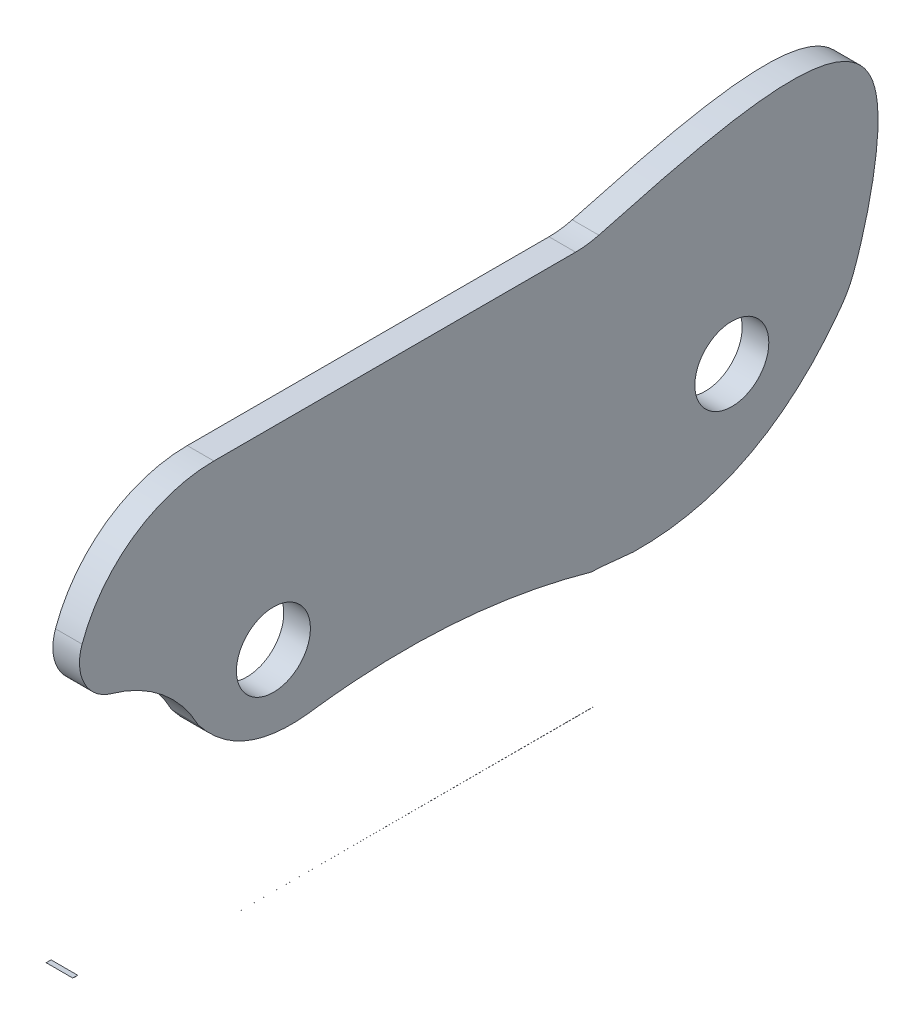
ISO-10303-21;
HEADER;
FILE_DESCRIPTION(('STEP AP214'),'2;1');
FILE_NAME('part.step','',(''),(''),'','','');
FILE_SCHEMA(('AUTOMOTIVE_DESIGN { 1 0 10303 214 1 1 1 1 }'));
ENDSEC;
DATA;
#1=APPLICATION_CONTEXT('core data for automotive mechanical design processes');
#2=APPLICATION_PROTOCOL_DEFINITION('international standard','automotive_design',2000,#1);
#3=PRODUCT_CONTEXT('',#1,'mechanical');
#4=PRODUCT('Part','Part','',(#3));
#5=PRODUCT_RELATED_PRODUCT_CATEGORY('part','',(#4));
#6=PRODUCT_DEFINITION_FORMATION('','',#4);
#7=PRODUCT_DEFINITION_CONTEXT('part definition',#1,'design');
#8=PRODUCT_DEFINITION('design','',#6,#7);
#9=PRODUCT_DEFINITION_SHAPE('','',#8);
#10=(LENGTH_UNIT() NAMED_UNIT(*) SI_UNIT(.MILLI.,.METRE.));
#11=(NAMED_UNIT(*) PLANE_ANGLE_UNIT() SI_UNIT($,.RADIAN.));
#12=(NAMED_UNIT(*) SI_UNIT($,.STERADIAN.) SOLID_ANGLE_UNIT());
#13=UNCERTAINTY_MEASURE_WITH_UNIT(LENGTH_MEASURE(1.E-05),#10,'distance_accuracy_value','');
#14=(GEOMETRIC_REPRESENTATION_CONTEXT(3) GLOBAL_UNCERTAINTY_ASSIGNED_CONTEXT((#13)) GLOBAL_UNIT_ASSIGNED_CONTEXT((#10,
#11,#12)) REPRESENTATION_CONTEXT('',''));
#15=CARTESIAN_POINT('',(0.,0.,0.));
#16=DIRECTION('',(0.,0.,1.));
#17=DIRECTION('',(1.,0.,0.));
#18=AXIS2_PLACEMENT_3D('',#15,#16,#17);
#19=CARTESIAN_POINT('',(2.40001341833316,-24.7901198806355,-19.4740823795841));
#20=DIRECTION('',(-1.,0.,0.));
#21=DIRECTION('',(0.,0.,1.));
#22=AXIS2_PLACEMENT_3D('',#19,#20,#21);
#23=CYLINDRICAL_SURFACE('',#22,9.46926716602788);
#24=CARTESIAN_POINT('',(0.60001341833316,-24.7901198806355,-19.4740823795841));
#25=DIRECTION('',(-1.,0.,0.));
#26=DIRECTION('',(0.,0.,-1.));
#27=AXIS2_PLACEMENT_3D('',#24,#25,#26);
#28=CIRCLE('',#27,9.46926716602788);
#29=CARTESIAN_POINT('',(0.60001341833316,-15.6754082380871,-22.0409973245727));
#30=VERTEX_POINT('',#29);
#31=CARTESIAN_POINT('',(0.60001341833316,-20.4302668559095,-27.8799554612099));
#32=VERTEX_POINT('',#31);
#33=EDGE_CURVE('E71',#30,#32,#28,.T.);
#34=ORIENTED_EDGE('',*,*,#33,.T.);
#35=DIRECTION('',(-1.,0.,0.));
#36=VECTOR('',#35,1.);
#37=CARTESIAN_POINT('',(2.40541363035987,-20.4302668559095,-27.8799554612099));
#38=LINE('',#37,#36);
#39=CARTESIAN_POINT('',(2.40001341833316,-20.4302668559092,-27.8799554612097));
#40=VERTEX_POINT('',#39);
#41=EDGE_CURVE('E160',#32,#40,#38,.F.);
#42=ORIENTED_EDGE('',*,*,#41,.T.);
#43=CARTESIAN_POINT('',(2.40001341833316,-24.7901198806355,-19.4740823795841));
#44=DIRECTION('',(-1.,0.,0.));
#45=DIRECTION('',(0.,0.,-1.));
#46=AXIS2_PLACEMENT_3D('',#43,#44,#45);
#47=CIRCLE('',#46,9.46926716602788);
#48=CARTESIAN_POINT('',(2.40001341833316,-15.6754082380871,-22.0409973245727));
#49=VERTEX_POINT('',#48);
#50=EDGE_CURVE('E80',#49,#40,#47,.T.);
#51=ORIENTED_EDGE('',*,*,#50,.F.);
#52=DIRECTION('',(-1.,0.,0.));
#53=VECTOR('',#52,1.);
#54=CARTESIAN_POINT('',(2.40001341833316,-15.6754082380871,-22.0409973245727));
#55=LINE('',#54,#53);
#56=EDGE_CURVE('E268',#49,#30,#55,.T.);
#57=ORIENTED_EDGE('',*,*,#56,.T.);
#58=EDGE_LOOP('',(#34,#42,#51,#57));
#59=FACE_BOUND('',#58,.T.);
#60=ADVANCED_FACE('F50',(#59),#23,.F.);
#61=CARTESIAN_POINT('',(0.60001341833316,-24.7848418515788,-54.5208886965009));
#62=CARTESIAN_POINT('',(0.60001341833316,-21.2595234428936,-42.0708640520346));
#63=CARTESIAN_POINT('',(0.60001341833316,-24.7901198806354,-28.943349545612));
#64=B_SPLINE_CURVE_WITH_KNOTS('',2,(#61,#62,#63),.UNSPECIFIED.,.F.,.F.,(3,3),(0.,1.),.UNSPECIFIED.);
#65=DIRECTION('',(1.,0.,0.));
#66=VECTOR('',#65,1.);
#67=SURFACE_OF_LINEAR_EXTRUSION('',#64,#66);
#68=CARTESIAN_POINT('',(2.40001341833316,-24.7848418515788,-54.5208886965009));
#69=CARTESIAN_POINT('',(2.40001341833316,-21.2595234428936,-42.0708640520346));
#70=CARTESIAN_POINT('',(2.40001341833316,-24.7901198806354,-28.943349545612));
#71=B_SPLINE_CURVE_WITH_KNOTS('',2,(#68,#69,#70),.UNSPECIFIED.,.F.,.F.,(3,3),(0.,1.),.UNSPECIFIED.);
#72=CARTESIAN_POINT('',(2.40001341833316,-24.7848418515788,-54.5208886965009));
#73=VERTEX_POINT('',#72);
#74=CARTESIAN_POINT('',(2.40001341833316,-23.4135283253131,-35.8601971759698));
#75=VERTEX_POINT('',#74);
#76=EDGE_CURVE('E153',#73,#75,#71,.T.);
#77=ORIENTED_EDGE('',*,*,#76,.T.);
#78=CARTESIAN_POINT('',(2.40001341833316,-23.4135283253131,-35.8601971759698));
#79=CARTESIAN_POINT('',(2.40001341833316,-23.4497514168221,-35.5774765919523));
#80=CARTESIAN_POINT('',(2.40001341833316,-23.4893386647293,-35.2944329907353));
#81=B_SPLINE_CURVE_WITH_KNOTS('',2,(#78,#79,#80),.UNSPECIFIED.,.F.,.F.,(3,3),(0.734735799910028,
0.756571213550189),.UNSPECIFIED.);
#82=CARTESIAN_POINT('',(2.40001341833316,-23.4893386647293,-35.2944329907353));
#83=VERTEX_POINT('',#82);
#84=EDGE_CURVE('E149',#75,#83,#81,.T.);
#85=ORIENTED_EDGE('',*,*,#84,.T.);
#86=DIRECTION('',(-1.,0.,0.));
#87=VECTOR('',#86,1.);
#88=CARTESIAN_POINT('',(2.40541363035987,-23.4893386647293,-35.2944329907353));
#89=LINE('',#88,#87);
#90=CARTESIAN_POINT('',(0.60001341833316,-23.4893386640537,-35.2944329955657));
#91=VERTEX_POINT('',#90);
#92=EDGE_CURVE('E159',#83,#91,#89,.T.);
#93=ORIENTED_EDGE('',*,*,#92,.T.);
#94=CARTESIAN_POINT('',(0.60001341833316,-24.7848418515788,-54.5208886965009));
#95=VERTEX_POINT('',#94);
#96=EDGE_CURVE('E251',#95,#91,#64,.T.);
#97=ORIENTED_EDGE('',*,*,#96,.F.);
#98=DIRECTION('',(1.,0.,0.));
#99=VECTOR('',#98,1.);
#100=CARTESIAN_POINT('',(0.60001341833316,-24.7848418515788,-54.5208886965009));
#101=LINE('',#100,#99);
#102=EDGE_CURVE('E165',#95,#73,#101,.T.);
#103=ORIENTED_EDGE('',*,*,#102,.T.);
#104=EDGE_LOOP('',(#77,#85,#93,#97,#103));
#105=FACE_BOUND('',#104,.T.);
#106=ADVANCED_FACE('F163',(#105),#67,.F.);
#107=CARTESIAN_POINT('',(2.40001341833316,-15.3208527146077,-54.2047711916011));
#108=DIRECTION('',(1.,0.,0.));
#109=DIRECTION('',(0.,0.,-1.));
#110=AXIS2_PLACEMENT_3D('',#107,#108,#109);
#111=PLANE('',#110);
#112=CARTESIAN_POINT('',(2.40001341833316,-18.5693317054409,-32.9699554674754));
#113=DIRECTION('',(1.,0.,0.));
#114=DIRECTION('',(0.,0.,-1.));
#115=AXIS2_PLACEMENT_3D('',#112,#113,#114);
#116=CIRCLE('',#115,2.5);
#117=CARTESIAN_POINT('',(2.40001341833316,-18.5693317054409,-35.4699554674754));
#118=VERTEX_POINT('',#117);
#119=EDGE_CURVE('E273',#118,#118,#116,.T.);
#120=ORIENTED_EDGE('',*,*,#119,.F.);
#121=EDGE_LOOP('',(#120));
#122=FACE_BOUND('',#121,.T.);
#123=CARTESIAN_POINT('',(2.40001341833316,-17.3340554454409,-63.9699554612099));
#124=DIRECTION('',(1.,0.,0.));
#125=DIRECTION('',(0.,0.,-1.));
#126=AXIS2_PLACEMENT_3D('',#123,#124,#125);
#127=CIRCLE('',#126,2.50000000000001);
#128=CARTESIAN_POINT('',(2.40001341833316,-17.3340554454409,-66.4699554612099));
#129=VERTEX_POINT('',#128);
#130=EDGE_CURVE('E257',#129,#129,#127,.T.);
#131=ORIENTED_EDGE('',*,*,#130,.F.);
#132=EDGE_LOOP('',(#131));
#133=FACE_BOUND('',#132,.T.);
#134=CARTESIAN_POINT('',(2.40001341833316,-18.8503558094443,-26.8487839627127));
#135=CARTESIAN_POINT('',(2.40001341833316,-24.3600503879187,-29.8787684044366));
#136=CARTESIAN_POINT('',(2.40001341833316,-23.4135257414344,-35.8602173434093));
#137=B_SPLINE_CURVE_WITH_KNOTS('',2,(#134,#135,#136),.UNSPECIFIED.,.F.,.F.,(3,3),(0.,1.),.UNSPECIFIED.);
#138=EDGE_CURVE('E13',#83,#40,#137,.F.);
#139=ORIENTED_EDGE('',*,*,#138,.F.);
#140=ORIENTED_EDGE('',*,*,#84,.F.);
#141=ORIENTED_EDGE('',*,*,#76,.F.);
#142=CARTESIAN_POINT('',(2.40001341833316,-30.7834209932727,-54.6514577618794));
#143=DIRECTION('',(1.,0.,0.));
#144=DIRECTION('',(0.,0.,-1.));
#145=AXIS2_PLACEMENT_3D('',#142,#143,#144);
#146=CIRCLE('',#145,6.);
#147=CARTESIAN_POINT('',(2.40001341833316,-24.8171769577666,-55.2870142965699));
#148=VERTEX_POINT('',#147);
#149=EDGE_CURVE('E167',#73,#148,#146,.F.);
#150=ORIENTED_EDGE('',*,*,#149,.T.);
#151=CARTESIAN_POINT('',(2.40001341833316,-5.50343526744832,-54.204771191601));
#152=CARTESIAN_POINT('',(2.40001341833316,-3.12439738314841,-62.9559066326995));
#153=CARTESIAN_POINT('',(2.40001341833316,0.130995677376843,-74.9306573395602));
#154=CARTESIAN_POINT('',(2.40001341833316,-15.2110230733231,-73.2906471079422));
#155=CARTESIAN_POINT('',(2.40001341833316,-26.1589313071452,-67.8079800495994));
#156=CARTESIAN_POINT('',(2.40001341833316,-25.1996643362324,-58.8556764672803));
#157=CARTESIAN_POINT('',(2.40001341833316,-24.769013648199,-54.8366538029846));
#158=B_SPLINE_CURVE_WITH_KNOTS('',3,(#151,#152,#153,#154,#155,#156,#157),.UNSPECIFIED.,.F.,.F.,
(4,1,1,1,4),(0.,0.376783583733936,0.5155776088737,0.782524737781,1.),.UNSPECIFIED.);
#159=CARTESIAN_POINT('',(2.40001341833316,-25.0205507828051,-57.3358438481414));
#160=VERTEX_POINT('',#159);
#161=EDGE_CURVE('E193',#160,#148,#158,.T.);
#162=ORIENTED_EDGE('',*,*,#161,.F.);
#163=CARTESIAN_POINT('',(2.40001341833316,-24.7848418515788,-54.5208886965009));
#164=CARTESIAN_POINT('',(2.40001341833316,-26.4123610341012,-65.5124253666385));
#165=CARTESIAN_POINT('',(2.40001341833316,-16.9140161600656,-71.8893045542904));
#166=B_SPLINE_CURVE_WITH_KNOTS('',2,(#163,#164,#165),.UNSPECIFIED.,.F.,.F.,(3,3),(0.,1.),.UNSPECIFIED.);
#167=CARTESIAN_POINT('',(2.40001341833316,-17.5759579812547,-71.4295946913671));
#168=VERTEX_POINT('',#167);
#169=EDGE_CURVE('E171',#160,#168,#166,.T.);
#170=ORIENTED_EDGE('',*,*,#169,.T.);
#171=CARTESIAN_POINT('',(2.40001341833316,-14.0745855446981,-66.5571834750881));
#172=DIRECTION('',(1.,0.,0.));
#173=DIRECTION('',(0.,0.,-1.));
#174=AXIS2_PLACEMENT_3D('',#171,#172,#173);
#175=CIRCLE('',#174,6.);
#176=CARTESIAN_POINT('',(2.40001341833316,-16.1624216085445,-72.1822115257295));
#177=VERTEX_POINT('',#176);
#178=EDGE_CURVE('E319',#168,#177,#175,.T.);
#179=ORIENTED_EDGE('',*,*,#178,.T.);
#180=CARTESIAN_POINT('',(2.40001341833316,-5.29405544544093,-54.9754492674754));
#181=VERTEX_POINT('',#180);
#182=EDGE_CURVE('E181',#181,#177,#158,.T.);
#183=ORIENTED_EDGE('',*,*,#182,.F.);
#184=CARTESIAN_POINT('',(2.40001341833316,0.496564732551688,-53.4042338289614));
#185=DIRECTION('',(1.,0.,0.));
#186=DIRECTION('',(0.,0.,-1.));
#187=AXIS2_PLACEMENT_3D('',#184,#185,#186);
#188=CIRCLE('',#187,6.);
#189=CARTESIAN_POINT('',(2.40001341833316,-5.50343526744831,-53.4042338289613));
#190=VERTEX_POINT('',#189);
#191=EDGE_CURVE('E359',#181,#190,#188,.F.);
#192=ORIENTED_EDGE('',*,*,#191,.T.);
#193=DIRECTION('',(0.,0.,1.));
#194=VECTOR('',#193,1.);
#195=CARTESIAN_POINT('',(2.40001341833316,-5.50343526744831,-28.943349545612));
#196=LINE('',#195,#194);
#197=CARTESIAN_POINT('',(2.40001341833316,-5.50343526744831,-28.943349545612));
#198=VERTEX_POINT('',#197);
#199=EDGE_CURVE('E357',#190,#198,#196,.T.);
#200=ORIENTED_EDGE('',*,*,#199,.T.);
#201=CARTESIAN_POINT('',(2.40001341833316,-14.9727024334761,-28.9433495456119));
#202=DIRECTION('',(1.,0.,0.));
#203=DIRECTION('',(0.,0.,-1.));
#204=AXIS2_PLACEMENT_3D('',#201,#202,#203);
#205=CIRCLE('',#204,9.46926716602774);
#206=CARTESIAN_POINT('',(2.40001341833316,-11.7745000105935,-20.0305204816234));
#207=VERTEX_POINT('',#206);
#208=EDGE_CURVE('E302',#198,#207,#205,.T.);
#209=ORIENTED_EDGE('',*,*,#208,.T.);
#210=CARTESIAN_POINT('',(2.40001341833316,-12.7877365261994,-22.8542328896853));
#211=DIRECTION('',(1.,0.,0.));
#212=DIRECTION('',(0.,0.,-1.));
#213=AXIS2_PLACEMENT_3D('',#210,#211,#212);
#214=CIRCLE('',#213,3.);
#215=EDGE_CURVE('E299',#207,#49,#214,.T.);
#216=ORIENTED_EDGE('',*,*,#215,.T.);
#217=ORIENTED_EDGE('',*,*,#50,.T.);
#218=EDGE_LOOP('',(#139,#140,#141,#150,#162,#170,#179,#183,#192,#200,#209,#216,#217));
#219=FACE_BOUND('',#218,.T.);
#220=ADVANCED_FACE('F52',(#122,#133,#219),#111,.T.);
#221=CARTESIAN_POINT('',(0.60001341833316,-15.3208527146077,-54.2047711916011));
#222=DIRECTION('',(1.,0.,0.));
#223=DIRECTION('',(0.,0.,-1.));
#224=AXIS2_PLACEMENT_3D('',#221,#222,#223);
#225=PLANE('',#224);
#226=CARTESIAN_POINT('',(0.60001341833316,-18.5693317054409,-32.9699554674754));
#227=DIRECTION('',(-1.,0.,0.));
#228=DIRECTION('',(0.,0.,1.));
#229=AXIS2_PLACEMENT_3D('',#226,#227,#228);
#230=CIRCLE('',#229,2.5);
#231=CARTESIAN_POINT('',(0.60001341833316,-18.5693317054409,-30.4699554674754));
#232=VERTEX_POINT('',#231);
#233=EDGE_CURVE('E277',#232,#232,#230,.T.);
#234=ORIENTED_EDGE('',*,*,#233,.F.);
#235=EDGE_LOOP('',(#234));
#236=FACE_BOUND('',#235,.T.);
#237=CARTESIAN_POINT('',(0.60001341833316,-17.3340554454409,-63.9699554612099));
#238=DIRECTION('',(-1.,0.,0.));
#239=DIRECTION('',(0.,0.,1.));
#240=AXIS2_PLACEMENT_3D('',#237,#238,#239);
#241=CIRCLE('',#240,2.50000000000001);
#242=CARTESIAN_POINT('',(0.60001341833316,-17.3340554454409,-61.4699554612099));
#243=VERTEX_POINT('',#242);
#244=EDGE_CURVE('E269',#243,#243,#241,.T.);
#245=ORIENTED_EDGE('',*,*,#244,.F.);
#246=EDGE_LOOP('',(#245));
#247=FACE_BOUND('',#246,.T.);
#248=ORIENTED_EDGE('',*,*,#96,.T.);
#249=CARTESIAN_POINT('',(0.60001341833316,-18.8503558094443,-26.8487839627127));
#250=CARTESIAN_POINT('',(0.60001341833316,-24.3600503879187,-29.8787684044366));
#251=CARTESIAN_POINT('',(0.60001341833316,-23.4135257414344,-35.8602173434093));
#252=B_SPLINE_CURVE_WITH_KNOTS('',2,(#249,#250,#251),.UNSPECIFIED.,.F.,.F.,(3,3),(0.,1.),.UNSPECIFIED.);
#253=EDGE_CURVE('E63',#32,#91,#252,.T.);
#254=ORIENTED_EDGE('',*,*,#253,.F.);
#255=ORIENTED_EDGE('',*,*,#33,.F.);
#256=CARTESIAN_POINT('',(0.60001341833316,-12.7877365261994,-22.8542328896853));
#257=DIRECTION('',(1.,0.,0.));
#258=DIRECTION('',(0.,0.,-1.));
#259=AXIS2_PLACEMENT_3D('',#256,#257,#258);
#260=CIRCLE('',#259,3.);
#261=CARTESIAN_POINT('',(0.60001341833316,-11.7745000105935,-20.0305204816234));
#262=VERTEX_POINT('',#261);
#263=EDGE_CURVE('E294',#30,#262,#260,.F.);
#264=ORIENTED_EDGE('',*,*,#263,.T.);
#265=CARTESIAN_POINT('',(0.60001341833316,-14.9727024334761,-28.9433495456119));
#266=DIRECTION('',(1.,0.,0.));
#267=DIRECTION('',(0.,0.,-1.));
#268=AXIS2_PLACEMENT_3D('',#265,#266,#267);
#269=CIRCLE('',#268,9.46926716602774);
#270=CARTESIAN_POINT('',(0.60001341833316,-5.50343526744831,-28.943349545612));
#271=VERTEX_POINT('',#270);
#272=EDGE_CURVE('E342',#271,#262,#269,.T.);
#273=ORIENTED_EDGE('',*,*,#272,.F.);
#274=DIRECTION('',(0.,0.,1.));
#275=VECTOR('',#274,1.);
#276=CARTESIAN_POINT('',(0.60001341833316,-5.50343526744831,-28.943349545612));
#277=LINE('',#276,#275);
#278=CARTESIAN_POINT('',(0.60001341833316,-5.50343526744831,-53.4042338289613));
#279=VERTEX_POINT('',#278);
#280=EDGE_CURVE('E350',#279,#271,#277,.T.);
#281=ORIENTED_EDGE('',*,*,#280,.F.);
#282=CARTESIAN_POINT('',(0.60001341833316,0.496564732551688,-53.4042338289614));
#283=DIRECTION('',(1.,0.,0.));
#284=DIRECTION('',(0.,0.,-1.));
#285=AXIS2_PLACEMENT_3D('',#282,#283,#284);
#286=CIRCLE('',#285,6.);
#287=CARTESIAN_POINT('',(0.60001341833316,-5.29405544544093,-54.9754492674754));
#288=VERTEX_POINT('',#287);
#289=EDGE_CURVE('E297',#279,#288,#286,.T.);
#290=ORIENTED_EDGE('',*,*,#289,.T.);
#291=CARTESIAN_POINT('',(0.60001341833316,-5.50343526744832,-54.204771191601));
#292=CARTESIAN_POINT('',(0.60001341833316,-3.12439738314841,-62.9559066326995));
#293=CARTESIAN_POINT('',(0.60001341833316,0.130995677376843,-74.9306573395602));
#294=CARTESIAN_POINT('',(0.60001341833316,-15.2110230733231,-73.2906471079422));
#295=CARTESIAN_POINT('',(0.60001341833316,-26.1589313071452,-67.8079800495994));
#296=CARTESIAN_POINT('',(0.60001341833316,-25.1996643362324,-58.8556764672803));
#297=CARTESIAN_POINT('',(0.60001341833316,-24.769013648199,-54.8366538029846));
#298=B_SPLINE_CURVE_WITH_KNOTS('',3,(#291,#292,#293,#294,#295,#296,#297),.UNSPECIFIED.,.F.,.F.,
(4,1,1,1,4),(0.,0.376783583733936,0.5155776088737,0.782524737781,1.),.UNSPECIFIED.);
#299=CARTESIAN_POINT('',(0.60001341833316,-16.1624216085445,-72.1822115257295));
#300=VERTEX_POINT('',#299);
#301=EDGE_CURVE('E194',#288,#300,#298,.T.);
#302=ORIENTED_EDGE('',*,*,#301,.T.);
#303=CARTESIAN_POINT('',(0.60001341833316,-14.0745855446981,-66.5571834750881));
#304=DIRECTION('',(1.,0.,0.));
#305=DIRECTION('',(0.,0.,-1.));
#306=AXIS2_PLACEMENT_3D('',#303,#304,#305);
#307=CIRCLE('',#306,6.);
#308=CARTESIAN_POINT('',(0.60001341833316,-17.5759579812547,-71.4295946913671));
#309=VERTEX_POINT('',#308);
#310=EDGE_CURVE('E423',#300,#309,#307,.F.);
#311=ORIENTED_EDGE('',*,*,#310,.T.);
#312=CARTESIAN_POINT('',(0.60001341833316,-24.7848418515788,-54.5208886965009));
#313=CARTESIAN_POINT('',(0.60001341833316,-26.4123610341012,-65.5124253666385));
#314=CARTESIAN_POINT('',(0.60001341833316,-16.9140161600656,-71.8893045542904));
#315=B_SPLINE_CURVE_WITH_KNOTS('',2,(#312,#313,#314),.UNSPECIFIED.,.F.,.F.,(3,3),(0.,1.),.UNSPECIFIED.);
#316=CARTESIAN_POINT('',(0.60001341833316,-25.0205507828051,-57.3358438481414));
#317=VERTEX_POINT('',#316);
#318=EDGE_CURVE('E256',#317,#309,#315,.T.);
#319=ORIENTED_EDGE('',*,*,#318,.F.);
#320=CARTESIAN_POINT('',(0.60001341833316,-24.8171769577657,-55.2870142965607));
#321=VERTEX_POINT('',#320);
#322=EDGE_CURVE('E426',#317,#321,#298,.T.);
#323=ORIENTED_EDGE('',*,*,#322,.T.);
#324=CARTESIAN_POINT('',(0.60001341833316,-30.7834209932727,-54.6514577618794));
#325=DIRECTION('',(1.,0.,0.));
#326=DIRECTION('',(0.,0.,-1.));
#327=AXIS2_PLACEMENT_3D('',#324,#325,#326);
#328=CIRCLE('',#327,6.);
#329=EDGE_CURVE('E292',#321,#95,#328,.T.);
#330=ORIENTED_EDGE('',*,*,#329,.T.);
#331=EDGE_LOOP('',(#248,#254,#255,#264,#273,#281,#290,#302,#311,#319,#323,#330));
#332=FACE_BOUND('',#331,.T.);
#333=ADVANCED_FACE('F207',(#236,#247,#332),#225,.F.);
#334=DIRECTION('',(-1.,0.,0.));
#335=VECTOR('',#334,1.);
#336=SURFACE_OF_LINEAR_EXTRUSION('',#158,#335);
#337=ORIENTED_EDGE('',*,*,#322,.F.);
#338=DIRECTION('',(1.,0.,0.));
#339=VECTOR('',#338,1.);
#340=CARTESIAN_POINT('',(-74.9383125257199,-25.0205507828056,-57.3358438481414));
#341=LINE('',#340,#339);
#342=EDGE_CURVE('E235',#317,#160,#341,.T.);
#343=ORIENTED_EDGE('',*,*,#342,.T.);
#344=ORIENTED_EDGE('',*,*,#161,.T.);
#345=DIRECTION('',(-1.,0.,0.));
#346=VECTOR('',#345,1.);
#347=CARTESIAN_POINT('',(2.40001341833316,-24.8171769577666,-55.2870142965699));
#348=LINE('',#347,#346);
#349=EDGE_CURVE('E192',#148,#321,#348,.T.);
#350=ORIENTED_EDGE('',*,*,#349,.T.);
#351=EDGE_LOOP('',(#337,#343,#344,#350));
#352=FACE_BOUND('',#351,.T.);
#353=ADVANCED_FACE('F202',(#352),#336,.T.);
#354=ORIENTED_EDGE('',*,*,#182,.T.);
#355=DIRECTION('',(-1.,0.,0.));
#356=VECTOR('',#355,1.);
#357=CARTESIAN_POINT('',(2.40001341833316,-16.1624216085445,-72.1822115257295));
#358=LINE('',#357,#356);
#359=EDGE_CURVE('E191',#177,#300,#358,.T.);
#360=ORIENTED_EDGE('',*,*,#359,.T.);
#361=ORIENTED_EDGE('',*,*,#301,.F.);
#362=DIRECTION('',(-1.,0.,0.));
#363=VECTOR('',#362,1.);
#364=CARTESIAN_POINT('',(0.60001341833316,-5.29405544544093,-54.9754492674754));
#365=LINE('',#364,#363);
#366=EDGE_CURVE('E372',#288,#181,#365,.F.);
#367=ORIENTED_EDGE('',*,*,#366,.T.);
#368=EDGE_LOOP('',(#354,#360,#361,#367));
#369=FACE_BOUND('',#368,.T.);
#370=ADVANCED_FACE('F206',(#369),#336,.T.);
#371=CARTESIAN_POINT('',(2.40001341833316,-5.50343526744831,-28.943349545612));
#372=DIRECTION('',(0.,-1.,0.));
#373=DIRECTION('',(0.,0.,-1.));
#374=AXIS2_PLACEMENT_3D('',#371,#372,#373);
#375=PLANE('',#374);
#376=ORIENTED_EDGE('',*,*,#199,.F.);
#377=DIRECTION('',(-1.,0.,0.));
#378=VECTOR('',#377,1.);
#379=CARTESIAN_POINT('',(2.40001341833316,-5.50343526744831,-53.4042338289614));
#380=LINE('',#379,#378);
#381=EDGE_CURVE('E353',#190,#279,#380,.T.);
#382=ORIENTED_EDGE('',*,*,#381,.T.);
#383=ORIENTED_EDGE('',*,*,#280,.T.);
#384=DIRECTION('',(-1.,0.,0.));
#385=VECTOR('',#384,1.);
#386=CARTESIAN_POINT('',(2.40001341833316,-5.50343526744831,-28.943349545612));
#387=LINE('',#386,#385);
#388=EDGE_CURVE('E311',#198,#271,#387,.T.);
#389=ORIENTED_EDGE('',*,*,#388,.F.);
#390=EDGE_LOOP('',(#376,#382,#383,#389));
#391=FACE_BOUND('',#390,.T.);
#392=ADVANCED_FACE('F218',(#391),#375,.F.);
#393=CARTESIAN_POINT('',(2.40001341833316,-14.9727024334761,-28.9433495456119));
#394=DIRECTION('',(-1.,0.,0.));
#395=DIRECTION('',(0.,0.,1.));
#396=AXIS2_PLACEMENT_3D('',#393,#394,#395);
#397=CYLINDRICAL_SURFACE('',#396,9.46926716602774);
#398=ORIENTED_EDGE('',*,*,#272,.T.);
#399=DIRECTION('',(-1.,0.,0.));
#400=VECTOR('',#399,1.);
#401=CARTESIAN_POINT('',(2.40001341833316,-11.7745000105935,-20.0305204816234));
#402=LINE('',#401,#400);
#403=EDGE_CURVE('E340',#262,#207,#402,.F.);
#404=ORIENTED_EDGE('',*,*,#403,.T.);
#405=ORIENTED_EDGE('',*,*,#208,.F.);
#406=ORIENTED_EDGE('',*,*,#388,.T.);
#407=EDGE_LOOP('',(#398,#404,#405,#406));
#408=FACE_BOUND('',#407,.T.);
#409=ADVANCED_FACE('F214',(#408),#397,.T.);
#410=CARTESIAN_POINT('',(1.50001341833316,0.496564732551688,-53.4042338289614));
#411=DIRECTION('',(-1.,0.,0.));
#412=DIRECTION('',(0.,0.,1.));
#413=AXIS2_PLACEMENT_3D('',#410,#411,#412);
#414=CYLINDRICAL_SURFACE('',#413,6.);
#415=ORIENTED_EDGE('',*,*,#191,.F.);
#416=ORIENTED_EDGE('',*,*,#366,.F.);
#417=ORIENTED_EDGE('',*,*,#289,.F.);
#418=ORIENTED_EDGE('',*,*,#381,.F.);
#419=EDGE_LOOP('',(#415,#416,#417,#418));
#420=FACE_BOUND('',#419,.T.);
#421=ADVANCED_FACE('F217',(#420),#414,.F.);
#422=CARTESIAN_POINT('',(1.50001341833316,-30.7834209932727,-54.6514577618794));
#423=DIRECTION('',(-1.,0.,0.));
#424=DIRECTION('',(0.,0.,1.));
#425=AXIS2_PLACEMENT_3D('',#422,#423,#424);
#426=CYLINDRICAL_SURFACE('',#425,6.);
#427=ORIENTED_EDGE('',*,*,#149,.F.);
#428=ORIENTED_EDGE('',*,*,#102,.F.);
#429=ORIENTED_EDGE('',*,*,#329,.F.);
#430=ORIENTED_EDGE('',*,*,#349,.F.);
#431=EDGE_LOOP('',(#427,#428,#429,#430));
#432=FACE_BOUND('',#431,.T.);
#433=ADVANCED_FACE('F413',(#432),#426,.F.);
#434=CARTESIAN_POINT('',(2.40001341833316,-12.7877365261994,-22.8542328896853));
#435=DIRECTION('',(1.,0.,0.));
#436=DIRECTION('',(0.,0.,-1.));
#437=AXIS2_PLACEMENT_3D('',#434,#435,#436);
#438=CYLINDRICAL_SURFACE('',#437,3.);
#439=ORIENTED_EDGE('',*,*,#215,.F.);
#440=ORIENTED_EDGE('',*,*,#403,.F.);
#441=ORIENTED_EDGE('',*,*,#263,.F.);
#442=ORIENTED_EDGE('',*,*,#56,.F.);
#443=EDGE_LOOP('',(#439,#440,#441,#442));
#444=FACE_BOUND('',#443,.T.);
#445=ADVANCED_FACE('F228',(#444),#438,.T.);
#446=CARTESIAN_POINT('',(-74.9383125257199,-24.7848418515788,-54.5208886965009));
#447=CARTESIAN_POINT('',(-74.9383125257199,-26.4123610341012,-65.5124253666385));
#448=CARTESIAN_POINT('',(-74.9383125257199,-16.9140161600656,-71.8893045542904));
#449=B_SPLINE_CURVE_WITH_KNOTS('',2,(#446,#447,#448),.UNSPECIFIED.,.F.,.F.,(3,3),(0.,1.),.UNSPECIFIED.);
#450=DIRECTION('',(1.,0.,0.));
#451=VECTOR('',#450,1.);
#452=SURFACE_OF_LINEAR_EXTRUSION('',#449,#451);
#453=ORIENTED_EDGE('',*,*,#318,.T.);
#454=DIRECTION('',(1.,0.,0.));
#455=VECTOR('',#454,1.);
#456=CARTESIAN_POINT('',(0.60001341833316,-17.5759579812547,-71.4295946913671));
#457=LINE('',#456,#455);
#458=EDGE_CURVE('E327',#309,#168,#457,.T.);
#459=ORIENTED_EDGE('',*,*,#458,.T.);
#460=ORIENTED_EDGE('',*,*,#169,.F.);
#461=ORIENTED_EDGE('',*,*,#342,.F.);
#462=EDGE_LOOP('',(#453,#459,#460,#461));
#463=FACE_BOUND('',#462,.T.);
#464=ADVANCED_FACE('F223',(#463),#452,.T.);
#465=CARTESIAN_POINT('',(1.50001341833316,-14.0745855446981,-66.5571834750881));
#466=DIRECTION('',(-1.,0.,0.));
#467=DIRECTION('',(0.,0.,1.));
#468=AXIS2_PLACEMENT_3D('',#465,#466,#467);
#469=CYLINDRICAL_SURFACE('',#468,6.);
#470=ORIENTED_EDGE('',*,*,#310,.F.);
#471=ORIENTED_EDGE('',*,*,#359,.F.);
#472=ORIENTED_EDGE('',*,*,#178,.F.);
#473=ORIENTED_EDGE('',*,*,#458,.F.);
#474=EDGE_LOOP('',(#470,#471,#472,#473));
#475=FACE_BOUND('',#474,.T.);
#476=ADVANCED_FACE('F227',(#475),#469,.T.);
#477=CARTESIAN_POINT('',(2.40541363035987,-18.8503558094443,-26.8487839627127));
#478=CARTESIAN_POINT('',(2.40541363035987,-24.3600503879187,-29.8787684044366));
#479=CARTESIAN_POINT('',(2.40541363035987,-23.4135257414344,-35.8602173434093));
#480=B_SPLINE_CURVE_WITH_KNOTS('',2,(#477,#478,#479),.UNSPECIFIED.,.F.,.F.,(3,3),(0.,1.),.UNSPECIFIED.);
#481=DIRECTION('',(-1.,0.,0.));
#482=VECTOR('',#481,1.);
#483=SURFACE_OF_LINEAR_EXTRUSION('',#480,#482);
#484=ORIENTED_EDGE('',*,*,#253,.T.);
#485=ORIENTED_EDGE('',*,*,#92,.F.);
#486=ORIENTED_EDGE('',*,*,#138,.T.);
#487=ORIENTED_EDGE('',*,*,#41,.F.);
#488=EDGE_LOOP('',(#484,#485,#486,#487));
#489=FACE_BOUND('',#488,.T.);
#490=ADVANCED_FACE('F230',(#489),#483,.F.);
#491=CARTESIAN_POINT('',(3.00452228510576,-17.3340554454409,-63.9699554612099));
#492=DIRECTION('',(-1.,0.,0.));
#493=DIRECTION('',(0.,0.,1.));
#494=AXIS2_PLACEMENT_3D('',#491,#492,#493);
#495=CYLINDRICAL_SURFACE('',#494,2.50000000000001);
#496=ORIENTED_EDGE('',*,*,#130,.T.);
#497=EDGE_LOOP('',(#496));
#498=FACE_BOUND('',#497,.T.);
#499=ORIENTED_EDGE('',*,*,#244,.T.);
#500=EDGE_LOOP('',(#499));
#501=FACE_BOUND('',#500,.T.);
#502=ADVANCED_FACE('F397',(#498,#501),#495,.F.);
#503=CARTESIAN_POINT('',(10.6000134183332,-18.5693317054409,-32.9699554674754));
#504=DIRECTION('',(-1.,0.,0.));
#505=DIRECTION('',(0.,0.,1.));
#506=AXIS2_PLACEMENT_3D('',#503,#504,#505);
#507=CYLINDRICAL_SURFACE('',#506,2.5);
#508=ORIENTED_EDGE('',*,*,#119,.T.);
#509=EDGE_LOOP('',(#508));
#510=FACE_BOUND('',#509,.T.);
#511=ORIENTED_EDGE('',*,*,#233,.T.);
#512=EDGE_LOOP('',(#511));
#513=FACE_BOUND('',#512,.T.);
#514=ADVANCED_FACE('F282',(#510,#513),#507,.F.);
#515=CLOSED_SHELL('',(#60,#106,#220,#333,#353,#370,#392,#409,#421,#433,#445,#464,#476,#490,#502,#514));
#516=MANIFOLD_SOLID_BREP('B2',#515);
#517=CARTESIAN_POINT('',(1.49999999999996,-28.0290522439949,-19.7454724182239));
#518=DIRECTION('',(1.,0.,0.));
#519=DIRECTION('',(0.,0.,-1.));
#520=AXIS2_PLACEMENT_3D('',#517,#518,#519);
#521=CYLINDRICAL_SURFACE('',#520,3.);
#522=DIRECTION('',(-1.,0.,0.));
#523=VECTOR('',#522,1.);
#524=CARTESIAN_POINT('',(2.40540021202667,-31.0290522439949,-19.7454724182238));
#525=LINE('',#524,#523);
#526=CARTESIAN_POINT('',(2.39999999999996,-31.0290522439949,-19.7454724182238));
#527=VERTEX_POINT('',#526);
#528=CARTESIAN_POINT('',(0.599999999999959,-31.0290522439949,-19.7454724182238));
#529=VERTEX_POINT('',#528);
#530=EDGE_CURVE('E48',#527,#529,#525,.T.);
#531=ORIENTED_EDGE('',*,*,#530,.F.);
#532=CARTESIAN_POINT('',(2.39999999999996,-28.0290522439949,-19.7454724182239));
#533=DIRECTION('',(1.,0.,0.));
#534=DIRECTION('',(0.,0.,-1.));
#535=AXIS2_PLACEMENT_3D('',#532,#533,#534);
#536=CIRCLE('',#535,3.);
#537=CARTESIAN_POINT('',(2.39999999999996,-31.0080639332115,-19.3912276504279));
#538=VERTEX_POINT('',#537);
#539=EDGE_CURVE('E608',#538,#527,#536,.T.);
#540=ORIENTED_EDGE('',*,*,#539,.F.);
#541=DIRECTION('',(-1.,0.,0.));
#542=VECTOR('',#541,1.);
#543=CARTESIAN_POINT('',(2.40540021202667,-31.0080639332114,-19.3912276504279));
#544=LINE('',#543,#542);
#545=CARTESIAN_POINT('',(0.599999999999959,-31.0080639332115,-19.3912276504279));
#546=VERTEX_POINT('',#545);
#547=EDGE_CURVE('E582',#546,#538,#544,.F.);
#548=ORIENTED_EDGE('',*,*,#547,.F.);
#549=CARTESIAN_POINT('',(0.599999999999959,-28.0290522439949,-19.7454724182239));
#550=DIRECTION('',(1.,0.,0.));
#551=DIRECTION('',(0.,0.,-1.));
#552=AXIS2_PLACEMENT_3D('',#549,#550,#551);
#553=CIRCLE('',#552,3.);
#554=EDGE_CURVE('E606',#529,#546,#553,.F.);
#555=ORIENTED_EDGE('',*,*,#554,.F.);
#556=EDGE_LOOP('',(#531,#540,#548,#555));
#557=FACE_BOUND('',#556,.T.);
#558=ADVANCED_FACE('F575',(#557),#521,.T.);
#559=CARTESIAN_POINT('',(0.599999999999959,-22.2259198066916,-42.5580204436659));
#560=DIRECTION('',(1.,0.,0.));
#561=DIRECTION('',(0.,0.,-1.));
#562=AXIS2_PLACEMENT_3D('',#559,#560,#561);
#563=PLANE('',#562);
#564=ORIENTED_EDGE('',*,*,#554,.T.);
#565=CARTESIAN_POINT('',(0.599999999999959,-30.3185928335183,-24.2134665954742));
#566=CARTESIAN_POINT('',(0.599999999999959,-31.6450865607112,-21.1549574423872));
#567=CARTESIAN_POINT('',(0.599999999999959,-31.6647593296661,-13.2402333763387));
#568=CARTESIAN_POINT('',(0.599999999999959,-25.7554229015282,-15.2020332147776));
#569=B_SPLINE_CURVE_WITH_KNOTS('',3,(#565,#566,#567,#568),.UNSPECIFIED.,.F.,.F.,(4,4),(0.,1.),.UNSPECIFIED.);
#570=EDGE_CURVE('E588',#529,#546,#569,.T.);
#571=ORIENTED_EDGE('',*,*,#570,.F.);
#572=EDGE_LOOP('',(#564,#571));
#573=FACE_BOUND('',#572,.T.);
#574=ADVANCED_FACE('F605',(#573),#563,.F.);
#575=CARTESIAN_POINT('',(2.39999999999996,-22.2259198066916,-42.5580204436659));
#576=DIRECTION('',(1.,0.,0.));
#577=DIRECTION('',(0.,0.,-1.));
#578=AXIS2_PLACEMENT_3D('',#575,#576,#577);
#579=PLANE('',#578);
#580=CARTESIAN_POINT('',(2.39999999999996,-30.3185928335183,-24.2134665954742));
#581=CARTESIAN_POINT('',(2.39999999999996,-31.6450865607112,-21.1549574423872));
#582=CARTESIAN_POINT('',(2.39999999999996,-31.6647593296661,-13.2402333763387));
#583=CARTESIAN_POINT('',(2.39999999999996,-25.7554229015282,-15.2020332147776));
#584=B_SPLINE_CURVE_WITH_KNOTS('',3,(#580,#581,#582,#583),.UNSPECIFIED.,.F.,.F.,(4,4),(0.,1.),.UNSPECIFIED.);
#585=EDGE_CURVE('E593',#538,#527,#584,.F.);
#586=ORIENTED_EDGE('',*,*,#585,.F.);
#587=ORIENTED_EDGE('',*,*,#539,.T.);
#588=EDGE_LOOP('',(#586,#587));
#589=FACE_BOUND('',#588,.T.);
#590=ADVANCED_FACE('F615',(#589),#579,.T.);
#591=CARTESIAN_POINT('',(2.40540021202667,-30.3185928335183,-24.2134665954742));
#592=CARTESIAN_POINT('',(2.40540021202667,-31.6450865607112,-21.1549574423872));
#593=CARTESIAN_POINT('',(2.40540021202667,-31.6647593296661,-13.2402333763387));
#594=CARTESIAN_POINT('',(2.40540021202667,-25.7554229015282,-15.2020332147776));
#595=B_SPLINE_CURVE_WITH_KNOTS('',3,(#591,#592,#593,#594),.UNSPECIFIED.,.F.,.F.,(4,4),(0.,1.),.UNSPECIFIED.);
#596=DIRECTION('',(-1.,0.,0.));
#597=VECTOR('',#596,1.);
#598=SURFACE_OF_LINEAR_EXTRUSION('',#595,#597);
#599=ORIENTED_EDGE('',*,*,#530,.T.);
#600=ORIENTED_EDGE('',*,*,#570,.T.);
#601=ORIENTED_EDGE('',*,*,#547,.T.);
#602=ORIENTED_EDGE('',*,*,#585,.T.);
#603=EDGE_LOOP('',(#599,#600,#601,#602));
#604=FACE_BOUND('',#603,.T.);
#605=ADVANCED_FACE('F598',(#604),#598,.F.);
#606=CLOSED_SHELL('',(#558,#574,#590,#605));
#607=MANIFOLD_SOLID_BREP('B7',#606);
#608=CARTESIAN_POINT('',(2.99911207307905,-22.6734546904674,-53.7581258604057));
#609=DIRECTION('',(1.,0.,0.));
#610=DIRECTION('',(0.,0.,-1.));
#611=AXIS2_PLACEMENT_3D('',#608,#609,#610);
#612=PLANE('',#611);
#613=DIRECTION('',(0.,0.000206354055921188,-0.999999978709002));
#614=VECTOR('',#613,1.);
#615=CARTESIAN_POINT('',(2.99911207307905,-32.1374438274385,-54.0742433653056));
#616=LINE('',#615,#614);
#617=CARTESIAN_POINT('',(2.99911207307905,-32.1427218564952,-28.4967042144166));
#618=VERTEX_POINT('',#617);
#619=CARTESIAN_POINT('',(2.99911207307905,-32.1374438274385,-54.0742433653056));
#620=VERTEX_POINT('',#619);
#621=EDGE_CURVE('E699',#618,#620,#616,.T.);
#622=ORIENTED_EDGE('',*,*,#621,.F.);
#623=DIRECTION('',(0.,0.,-1.));
#624=VECTOR('',#623,1.);
#625=CARTESIAN_POINT('',(2.99911207307905,-32.1427218564952,-28.4967042144166));
#626=LINE('',#625,#624);
#627=CARTESIAN_POINT('',(2.99911207307905,-32.1427218564952,-53.7581258604057));
#628=VERTEX_POINT('',#627);
#629=EDGE_CURVE('E704',#618,#628,#626,.T.);
#630=ORIENTED_EDGE('',*,*,#629,.T.);
#631=CARTESIAN_POINT('',(2.99911207307905,-22.6734546904674,-53.7581258604057));
#632=DIRECTION('',(1.,0.,0.));
#633=DIRECTION('',(0.,0.,-1.));
#634=AXIS2_PLACEMENT_3D('',#631,#632,#633);
#635=CIRCLE('',#634,9.46926716602774);
#636=EDGE_CURVE('E697',#628,#620,#635,.T.);
#637=ORIENTED_EDGE('',*,*,#636,.T.);
#638=EDGE_LOOP('',(#622,#630,#637));
#639=FACE_BOUND('',#638,.T.);
#640=ADVANCED_FACE('F669',(#639),#612,.T.);
#641=CARTESIAN_POINT('',(1.19911207307905,-32.1374438274385,-54.0742433653056));
#642=DIRECTION('',(0.,-0.999999978709001,-0.000206354055921188));
#643=DIRECTION('',(0.,0.000206354055921188,-0.999999978709002));
#644=AXIS2_PLACEMENT_3D('',#641,#642,#643);
#645=PLANE('',#644);
#646=ORIENTED_EDGE('',*,*,#621,.T.);
#647=CARTESIAN_POINT('',(2.99911207307905,-32.1374438274385,-54.0742433653056));
#648=CARTESIAN_POINT('',(2.99733010819912,-32.1374546963515,-54.0215721800871));
#649=CARTESIAN_POINT('',(2.99599649883604,-32.137465566819,-53.9688934614341));
#650=CARTESIAN_POINT('',(2.99422599118629,-32.1374873108625,-53.8635209598));
#651=CARTESIAN_POINT('',(2.99378909285637,-32.1374981844386,-53.8108271768198));
#652=CARTESIAN_POINT('',(2.99380055000006,-32.1375090595692,-53.7581258604057));
#653=B_SPLINE_CURVE_WITH_KNOTS('',3,(#647,#648,#649,#650,#651,#652),.UNSPECIFIED.,.F.,.F.,(4,2,
4),(0.,0.158086793500437,0.316173579375802),.UNSPECIFIED.);
#654=CARTESIAN_POINT('',(2.99380055000006,-32.1375090595692,-53.7581258604057));
#655=VERTEX_POINT('',#654);
#656=EDGE_CURVE('E573',#620,#655,#653,.T.);
#657=ORIENTED_EDGE('',*,*,#656,.T.);
#658=CARTESIAN_POINT('',(7.19911207307905,-27.8578647993695,-20793.0847651019));
#659=DIRECTION('',(0.,-0.999999978709001,-0.000206354055921188));
#660=DIRECTION('',(0.,0.000206354055921188,-0.999999978709002));
#661=AXIS2_PLACEMENT_3D('',#658,#659,#660);
#662=ELLIPSE('',#661,29076.2397337688,6.);
#663=EDGE_CURVE('E678',#655,#618,#662,.F.);
#664=ORIENTED_EDGE('',*,*,#663,.T.);
#665=EDGE_LOOP('',(#646,#657,#664));
#666=FACE_BOUND('',#665,.T.);
#667=ADVANCED_FACE('F700',(#666),#645,.F.);
#668=CARTESIAN_POINT('',(7.19911207307905,-27.8578647993695,-28.4967042144166));
#669=DIRECTION('',(0.,0.,-1.));
#670=DIRECTION('',(-1.,0.,0.));
#671=AXIS2_PLACEMENT_3D('',#668,#669,#670);
#672=CYLINDRICAL_SURFACE('',#671,6.);
#673=CARTESIAN_POINT('',(7.19911207307905,-27.8578647993695,-53.7581258604056));
#674=DIRECTION('',(0.,0.,-1.));
#675=DIRECTION('',(-1.,0.,0.));
#676=AXIS2_PLACEMENT_3D('',#673,#674,#675);
#677=CIRCLE('',#676,6.);
#678=EDGE_CURVE('E673',#628,#655,#677,.T.);
#679=ORIENTED_EDGE('',*,*,#678,.F.);
#680=ORIENTED_EDGE('',*,*,#629,.F.);
#681=ORIENTED_EDGE('',*,*,#663,.F.);
#682=EDGE_LOOP('',(#679,#680,#681));
#683=FACE_BOUND('',#682,.T.);
#684=ADVANCED_FACE('F671',(#683),#672,.T.);
#685=CARTESIAN_POINT('',(7.19911207307905,-22.6734546904674,-53.7581258604057));
#686=DIRECTION('',(-1.,0.,0.));
#687=DIRECTION('',(0.,0.,1.));
#688=AXIS2_PLACEMENT_3D('',#685,#686,#687);
#689=DEGENERATE_TOROIDAL_SURFACE('',#688,5.18441010890203,6.,.T.);
#690=ORIENTED_EDGE('',*,*,#636,.F.);
#691=ORIENTED_EDGE('',*,*,#678,.T.);
#692=ORIENTED_EDGE('',*,*,#656,.F.);
#693=EDGE_LOOP('',(#690,#691,#692));
#694=FACE_BOUND('',#693,.T.);
#695=ADVANCED_FACE('F695',(#694),#689,.T.);
#696=CLOSED_SHELL('',(#640,#667,#684,#695));
#697=MANIFOLD_SOLID_BREP('B42',#696);
#698=ADVANCED_BREP_SHAPE_REPRESENTATION('',(#18,#516,#607,#697),#14);
#699=SHAPE_DEFINITION_REPRESENTATION(#9,#698);
ENDSEC;
END-ISO-10303-21;
